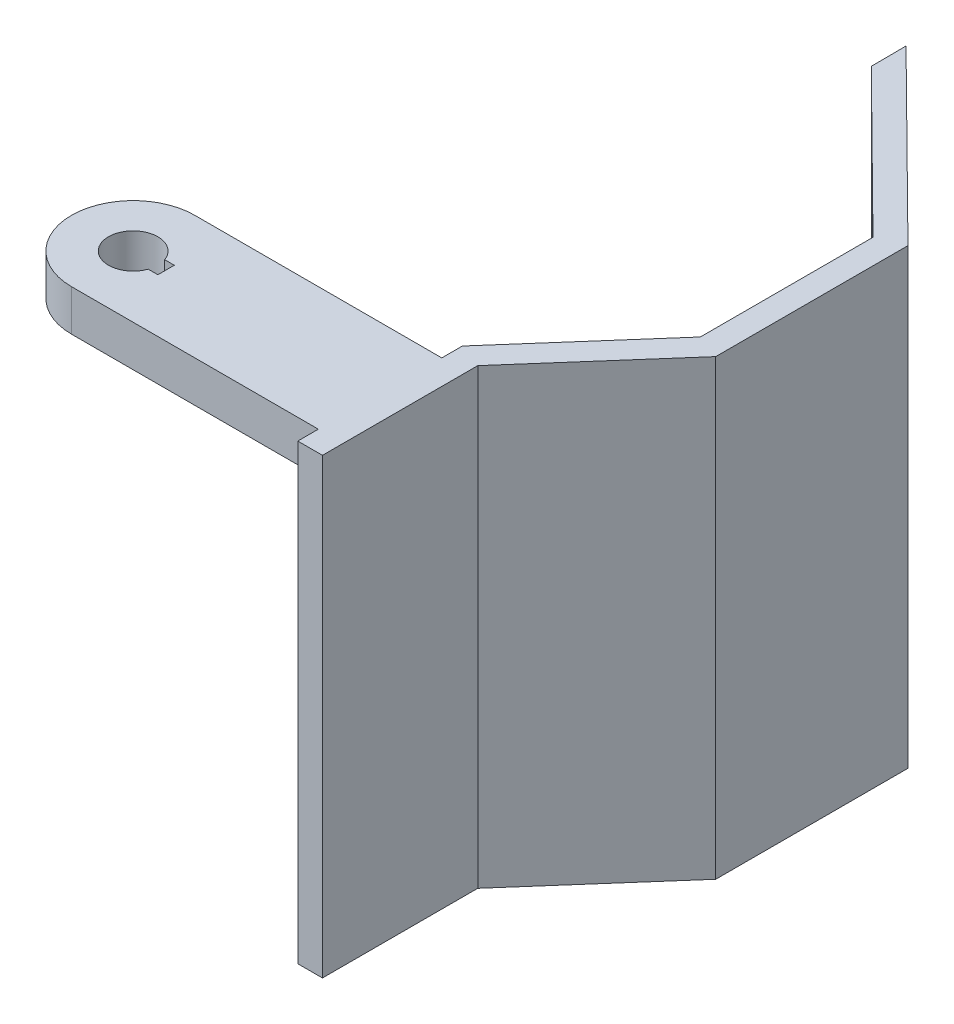
ISO-10303-21;
HEADER;
FILE_DESCRIPTION(('STEP AP214'),'2;1');
FILE_NAME('part.step','',(''),(''),'','','');
FILE_SCHEMA(('AUTOMOTIVE_DESIGN { 1 0 10303 214 1 1 1 1 }'));
ENDSEC;
DATA;
#1=APPLICATION_CONTEXT('core data for automotive mechanical design processes');
#2=APPLICATION_PROTOCOL_DEFINITION('international standard','automotive_design',2000,#1);
#3=PRODUCT_CONTEXT('',#1,'mechanical');
#4=PRODUCT('Part','Part','',(#3));
#5=PRODUCT_RELATED_PRODUCT_CATEGORY('part','',(#4));
#6=PRODUCT_DEFINITION_FORMATION('','',#4);
#7=PRODUCT_DEFINITION_CONTEXT('part definition',#1,'design');
#8=PRODUCT_DEFINITION('design','',#6,#7);
#9=PRODUCT_DEFINITION_SHAPE('','',#8);
#10=(LENGTH_UNIT() NAMED_UNIT(*) SI_UNIT(.MILLI.,.METRE.));
#11=(NAMED_UNIT(*) PLANE_ANGLE_UNIT() SI_UNIT($,.RADIAN.));
#12=(NAMED_UNIT(*) SI_UNIT($,.STERADIAN.) SOLID_ANGLE_UNIT());
#13=UNCERTAINTY_MEASURE_WITH_UNIT(LENGTH_MEASURE(1.E-05),#10,'distance_accuracy_value','');
#14=(GEOMETRIC_REPRESENTATION_CONTEXT(3) GLOBAL_UNCERTAINTY_ASSIGNED_CONTEXT((#13)) GLOBAL_UNIT_ASSIGNED_CONTEXT((#10,
#11,#12)) REPRESENTATION_CONTEXT('',''));
#15=CARTESIAN_POINT('',(0.,0.,0.));
#16=DIRECTION('',(0.,0.,1.));
#17=DIRECTION('',(1.,0.,0.));
#18=AXIS2_PLACEMENT_3D('',#15,#16,#17);
#19=CARTESIAN_POINT('',(0.,55.,0.));
#20=DIRECTION('',(0.,0.,1.));
#21=DIRECTION('',(-1.,0.,0.));
#22=AXIS2_PLACEMENT_3D('',#19,#20,#21);
#23=PLANE('',#22);
#24=DIRECTION('',(1.,0.,0.));
#25=VECTOR('',#24,1.);
#26=CARTESIAN_POINT('',(0.,0.,0.));
#27=LINE('',#26,#25);
#28=CARTESIAN_POINT('',(-3.,0.,0.));
#29=VERTEX_POINT('',#28);
#30=CARTESIAN_POINT('',(0.,0.,0.));
#31=VERTEX_POINT('',#30);
#32=EDGE_CURVE('E236',#29,#31,#27,.T.);
#33=ORIENTED_EDGE('',*,*,#32,.T.);
#34=DIRECTION('',(0.,-1.,0.));
#35=VECTOR('',#34,1.);
#36=CARTESIAN_POINT('',(0.,55.,0.));
#37=LINE('',#36,#35);
#38=CARTESIAN_POINT('',(0.,55.,0.));
#39=VERTEX_POINT('',#38);
#40=EDGE_CURVE('E284',#39,#31,#37,.T.);
#41=ORIENTED_EDGE('',*,*,#40,.F.);
#42=DIRECTION('',(1.,0.,0.));
#43=VECTOR('',#42,1.);
#44=CARTESIAN_POINT('',(0.,55.,0.));
#45=LINE('',#44,#43);
#46=CARTESIAN_POINT('',(-3.,55.,0.));
#47=VERTEX_POINT('',#46);
#48=EDGE_CURVE('E246',#47,#39,#45,.T.);
#49=ORIENTED_EDGE('',*,*,#48,.F.);
#50=DIRECTION('',(0.,-1.,0.));
#51=VECTOR('',#50,1.);
#52=CARTESIAN_POINT('',(-3.,55.,0.));
#53=LINE('',#52,#51);
#54=EDGE_CURVE('E354',#47,#29,#53,.T.);
#55=ORIENTED_EDGE('',*,*,#54,.T.);
#56=EDGE_LOOP('',(#33,#41,#49,#55));
#57=FACE_BOUND('',#56,.T.);
#58=ADVANCED_FACE('F48',(#57),#23,.T.);
#59=CARTESIAN_POINT('',(-3.,55.,0.));
#60=DIRECTION('',(1.,0.,0.));
#61=DIRECTION('',(0.,0.,1.));
#62=AXIS2_PLACEMENT_3D('',#59,#60,#61);
#63=PLANE('',#62);
#64=DIRECTION('',(0.,0.,-1.));
#65=VECTOR('',#64,1.);
#66=CARTESIAN_POINT('',(-3.,55.,0.));
#67=LINE('',#66,#65);
#68=CARTESIAN_POINT('',(-3.,55.,-17.5));
#69=VERTEX_POINT('',#68);
#70=CARTESIAN_POINT('',(-3.,55.,-20.));
#71=VERTEX_POINT('',#70);
#72=EDGE_CURVE('E250',#69,#71,#67,.T.);
#73=ORIENTED_EDGE('',*,*,#72,.T.);
#74=DIRECTION('',(0.,-1.,0.));
#75=VECTOR('',#74,1.);
#76=CARTESIAN_POINT('',(-3.,55.,-20.));
#77=LINE('',#76,#75);
#78=CARTESIAN_POINT('',(-3.,0.,-20.));
#79=VERTEX_POINT('',#78);
#80=EDGE_CURVE('E350',#71,#79,#77,.T.);
#81=ORIENTED_EDGE('',*,*,#80,.T.);
#82=DIRECTION('',(0.,0.,-1.));
#83=VECTOR('',#82,1.);
#84=CARTESIAN_POINT('',(-3.,0.,0.));
#85=LINE('',#84,#83);
#86=EDGE_CURVE('E288',#29,#79,#85,.T.);
#87=ORIENTED_EDGE('',*,*,#86,.F.);
#88=ORIENTED_EDGE('',*,*,#54,.F.);
#89=CARTESIAN_POINT('',(-3.,55.,-2.5));
#90=VERTEX_POINT('',#89);
#91=EDGE_CURVE('E252',#47,#90,#67,.T.);
#92=ORIENTED_EDGE('',*,*,#91,.T.);
#93=DIRECTION('',(0.,1.,0.));
#94=VECTOR('',#93,1.);
#95=CARTESIAN_POINT('',(-3.,50.,-2.5));
#96=LINE('',#95,#94);
#97=CARTESIAN_POINT('',(-3.,50.,-2.5));
#98=VERTEX_POINT('',#97);
#99=EDGE_CURVE('E223',#98,#90,#96,.T.);
#100=ORIENTED_EDGE('',*,*,#99,.F.);
#101=DIRECTION('',(0.,0.,1.));
#102=VECTOR('',#101,1.);
#103=CARTESIAN_POINT('',(-3.,50.,0.));
#104=LINE('',#103,#102);
#105=CARTESIAN_POINT('',(-3.,50.,-17.5));
#106=VERTEX_POINT('',#105);
#107=EDGE_CURVE('E209',#106,#98,#104,.T.);
#108=ORIENTED_EDGE('',*,*,#107,.F.);
#109=DIRECTION('',(0.,1.,0.));
#110=VECTOR('',#109,1.);
#111=CARTESIAN_POINT('',(-3.,50.,-17.5));
#112=LINE('',#111,#110);
#113=EDGE_CURVE('E232',#106,#69,#112,.T.);
#114=ORIENTED_EDGE('',*,*,#113,.T.);
#115=EDGE_LOOP('',(#73,#81,#87,#88,#92,#100,#108,#114));
#116=FACE_BOUND('',#115,.T.);
#117=ADVANCED_FACE('F382',(#116),#63,.F.);
#118=CARTESIAN_POINT('',(-11.6103440031896,55.,-10.1759094573042));
#119=DIRECTION('',(0.752035287081566,0.,0.659122846656181));
#120=DIRECTION('',(-0.659122846656181,0.,0.752035287081566));
#121=AXIS2_PLACEMENT_3D('',#118,#119,#120);
#122=PLANE('',#121);
#123=DIRECTION('',(0.659122846656181,0.,-0.752035287081566));
#124=VECTOR('',#123,1.);
#125=CARTESIAN_POINT('',(-11.6103440031896,0.,-10.1759094573042));
#126=LINE('',#125,#124);
#127=CARTESIAN_POINT('',(10.505514798512,0.,-35.409303061196));
#128=VERTEX_POINT('',#127);
#129=EDGE_CURVE('E292',#79,#128,#126,.T.);
#130=ORIENTED_EDGE('',*,*,#129,.F.);
#131=ORIENTED_EDGE('',*,*,#80,.F.);
#132=DIRECTION('',(0.659122846656181,0.,-0.752035287081566));
#133=VECTOR('',#132,1.);
#134=CARTESIAN_POINT('',(-11.6103440031896,55.,-10.1759094573042));
#135=LINE('',#134,#133);
#136=CARTESIAN_POINT('',(10.505514798512,55.,-35.409303061196));
#137=VERTEX_POINT('',#136);
#138=EDGE_CURVE('E256',#71,#137,#135,.T.);
#139=ORIENTED_EDGE('',*,*,#138,.T.);
#140=DIRECTION('',(0.,-1.,0.));
#141=VECTOR('',#140,1.);
#142=CARTESIAN_POINT('',(10.505514798512,55.,-35.409303061196));
#143=LINE('',#142,#141);
#144=EDGE_CURVE('E346',#137,#128,#143,.T.);
#145=ORIENTED_EDGE('',*,*,#144,.T.);
#146=EDGE_LOOP('',(#130,#131,#139,#145));
#147=FACE_BOUND('',#146,.T.);
#148=ADVANCED_FACE('F387',(#147),#122,.F.);
#149=CARTESIAN_POINT('',(10.505514798512,55.,0.));
#150=DIRECTION('',(1.,0.,0.));
#151=DIRECTION('',(0.,0.,1.));
#152=AXIS2_PLACEMENT_3D('',#149,#150,#151);
#153=PLANE('',#152);
#154=DIRECTION('',(0.,0.,-1.));
#155=VECTOR('',#154,1.);
#156=CARTESIAN_POINT('',(10.505514798512,0.,0.));
#157=LINE('',#156,#155);
#158=CARTESIAN_POINT('',(10.505514798512,0.,-56.3844767940236));
#159=VERTEX_POINT('',#158);
#160=EDGE_CURVE('E296',#128,#159,#157,.T.);
#161=ORIENTED_EDGE('',*,*,#160,.F.);
#162=ORIENTED_EDGE('',*,*,#144,.F.);
#163=DIRECTION('',(0.,0.,-1.));
#164=VECTOR('',#163,1.);
#165=CARTESIAN_POINT('',(10.505514798512,55.,0.));
#166=LINE('',#165,#164);
#167=CARTESIAN_POINT('',(10.505514798512,55.,-56.3844767940236));
#168=VERTEX_POINT('',#167);
#169=EDGE_CURVE('E260',#137,#168,#166,.T.);
#170=ORIENTED_EDGE('',*,*,#169,.T.);
#171=DIRECTION('',(0.,-1.,0.));
#172=VECTOR('',#171,1.);
#173=CARTESIAN_POINT('',(10.505514798512,55.,-56.3844767940236));
#174=LINE('',#173,#172);
#175=EDGE_CURVE('E342',#168,#159,#174,.T.);
#176=ORIENTED_EDGE('',*,*,#175,.T.);
#177=EDGE_LOOP('',(#161,#162,#170,#176));
#178=FACE_BOUND('',#177,.T.);
#179=ADVANCED_FACE('F410',(#178),#153,.F.);
#180=CARTESIAN_POINT('',(33.3838448037325,55.,-33.7632066765023));
#181=DIRECTION('',(0.70310060646766,0.,-0.711090386086614));
#182=DIRECTION('',(0.711090386086614,0.,0.70310060646766));
#183=AXIS2_PLACEMENT_3D('',#180,#181,#182);
#184=PLANE('',#183);
#185=DIRECTION('',(-0.711090386086614,0.,-0.70310060646766));
#186=VECTOR('',#185,1.);
#187=CARTESIAN_POINT('',(33.3838448037325,0.,-33.7632066765023));
#188=LINE('',#187,#186);
#189=CARTESIAN_POINT('',(-7.59252972399853,0.,-74.2791725016744));
#190=VERTEX_POINT('',#189);
#191=EDGE_CURVE('E300',#159,#190,#188,.T.);
#192=ORIENTED_EDGE('',*,*,#191,.F.);
#193=ORIENTED_EDGE('',*,*,#175,.F.);
#194=DIRECTION('',(-0.711090386086614,0.,-0.70310060646766));
#195=VECTOR('',#194,1.);
#196=CARTESIAN_POINT('',(33.3838448037325,55.,-33.7632066765023));
#197=LINE('',#196,#195);
#198=CARTESIAN_POINT('',(-7.59252972399853,55.,-74.2791725016744));
#199=VERTEX_POINT('',#198);
#200=EDGE_CURVE('E264',#168,#199,#197,.T.);
#201=ORIENTED_EDGE('',*,*,#200,.T.);
#202=DIRECTION('',(0.,-1.,0.));
#203=VECTOR('',#202,1.);
#204=CARTESIAN_POINT('',(-7.59252972399853,55.,-74.2791725016744));
#205=LINE('',#204,#203);
#206=EDGE_CURVE('E338',#199,#190,#205,.T.);
#207=ORIENTED_EDGE('',*,*,#206,.T.);
#208=EDGE_LOOP('',(#192,#193,#201,#207));
#209=FACE_BOUND('',#208,.T.);
#210=ADVANCED_FACE('F413',(#209),#184,.F.);
#211=CARTESIAN_POINT('',(-7.17264443633418,55.,0.0405234148945547));
#212=DIRECTION('',(0.999984040728061,0.,-0.00564962734874768));
#213=DIRECTION('',(0.00564962734874768,0.,0.999984040728061));
#214=AXIS2_PLACEMENT_3D('',#211,#212,#213);
#215=PLANE('',#214);
#216=DIRECTION('',(-0.00564962734874768,0.,-0.999984040728061));
#217=VECTOR('',#216,1.);
#218=CARTESIAN_POINT('',(-7.17264443633418,0.,0.0405234148945547));
#219=LINE('',#218,#217);
#220=CARTESIAN_POINT('',(-7.61649906285539,0.,-78.5217454793372));
#221=VERTEX_POINT('',#220);
#222=EDGE_CURVE('E304',#190,#221,#219,.T.);
#223=ORIENTED_EDGE('',*,*,#222,.F.);
#224=ORIENTED_EDGE('',*,*,#206,.F.);
#225=DIRECTION('',(-0.00564962734874768,0.,-0.999984040728061));
#226=VECTOR('',#225,1.);
#227=CARTESIAN_POINT('',(-7.17264443633418,55.,0.0405234148945547));
#228=LINE('',#227,#226);
#229=CARTESIAN_POINT('',(-7.61649906285539,55.,-78.5217454793372));
#230=VERTEX_POINT('',#229);
#231=EDGE_CURVE('E268',#199,#230,#228,.T.);
#232=ORIENTED_EDGE('',*,*,#231,.T.);
#233=DIRECTION('',(0.,-1.,0.));
#234=VECTOR('',#233,1.);
#235=CARTESIAN_POINT('',(-7.61649906285539,55.,-78.5217454793372));
#236=LINE('',#235,#234);
#237=EDGE_CURVE('E334',#230,#221,#236,.T.);
#238=ORIENTED_EDGE('',*,*,#237,.T.);
#239=EDGE_LOOP('',(#223,#224,#232,#238));
#240=FACE_BOUND('',#239,.T.);
#241=ADVANCED_FACE('F416',(#240),#215,.F.);
#242=CARTESIAN_POINT('',(35.4931466231355,55.,-35.8964778347622));
#243=DIRECTION('',(0.70310060646766,0.,-0.711090386086614));
#244=DIRECTION('',(0.711090386086614,0.,0.70310060646766));
#245=AXIS2_PLACEMENT_3D('',#242,#243,#244);
#246=PLANE('',#245);
#247=DIRECTION('',(-0.711090386086614,0.,-0.70310060646766));
#248=VECTOR('',#247,1.);
#249=CARTESIAN_POINT('',(35.4931466231355,0.,-35.8964778347622));
#250=LINE('',#249,#248);
#251=CARTESIAN_POINT('',(13.505514798512,0.,-57.6370576164122));
#252=VERTEX_POINT('',#251);
#253=EDGE_CURVE('E308',#252,#221,#250,.T.);
#254=ORIENTED_EDGE('',*,*,#253,.T.);
#255=ORIENTED_EDGE('',*,*,#237,.F.);
#256=DIRECTION('',(-0.711090386086614,0.,-0.70310060646766));
#257=VECTOR('',#256,1.);
#258=CARTESIAN_POINT('',(35.4931466231355,55.,-35.8964778347622));
#259=LINE('',#258,#257);
#260=CARTESIAN_POINT('',(13.505514798512,55.,-57.6370576164122));
#261=VERTEX_POINT('',#260);
#262=EDGE_CURVE('E272',#261,#230,#259,.T.);
#263=ORIENTED_EDGE('',*,*,#262,.F.);
#264=DIRECTION('',(0.,-1.,0.));
#265=VECTOR('',#264,1.);
#266=CARTESIAN_POINT('',(13.505514798512,55.,-57.6370576164122));
#267=LINE('',#266,#265);
#268=EDGE_CURVE('E330',#261,#252,#267,.T.);
#269=ORIENTED_EDGE('',*,*,#268,.T.);
#270=EDGE_LOOP('',(#254,#255,#263,#269));
#271=FACE_BOUND('',#270,.T.);
#272=ADVANCED_FACE('F420',(#271),#246,.T.);
#273=CARTESIAN_POINT('',(13.505514798512,55.,0.));
#274=DIRECTION('',(1.,0.,0.));
#275=DIRECTION('',(0.,0.,1.));
#276=AXIS2_PLACEMENT_3D('',#273,#274,#275);
#277=PLANE('',#276);
#278=DIRECTION('',(0.,0.,-1.));
#279=VECTOR('',#278,1.);
#280=CARTESIAN_POINT('',(13.505514798512,0.,0.));
#281=LINE('',#280,#279);
#282=CARTESIAN_POINT('',(13.505514798512,0.,-34.2806907812103));
#283=VERTEX_POINT('',#282);
#284=EDGE_CURVE('E311',#283,#252,#281,.T.);
#285=ORIENTED_EDGE('',*,*,#284,.T.);
#286=ORIENTED_EDGE('',*,*,#268,.F.);
#287=DIRECTION('',(0.,0.,-1.));
#288=VECTOR('',#287,1.);
#289=CARTESIAN_POINT('',(13.505514798512,55.,0.));
#290=LINE('',#289,#288);
#291=CARTESIAN_POINT('',(13.505514798512,55.,-34.2806907812103));
#292=VERTEX_POINT('',#291);
#293=EDGE_CURVE('E275',#292,#261,#290,.T.);
#294=ORIENTED_EDGE('',*,*,#293,.F.);
#295=DIRECTION('',(0.,-1.,0.));
#296=VECTOR('',#295,1.);
#297=CARTESIAN_POINT('',(13.505514798512,55.,-34.2806907812103));
#298=LINE('',#297,#296);
#299=EDGE_CURVE('E326',#292,#283,#298,.T.);
#300=ORIENTED_EDGE('',*,*,#299,.T.);
#301=EDGE_LOOP('',(#285,#286,#294,#300));
#302=FACE_BOUND('',#301,.T.);
#303=ADVANCED_FACE('F425',(#302),#277,.T.);
#304=CARTESIAN_POINT('',(-9.35423814194485,55.,-8.19854091733569));
#305=DIRECTION('',(0.752035287081566,0.,0.659122846656181));
#306=DIRECTION('',(-0.659122846656181,0.,0.752035287081566));
#307=AXIS2_PLACEMENT_3D('',#304,#305,#306);
#308=PLANE('',#307);
#309=DIRECTION('',(0.659122846656181,0.,-0.752035287081566));
#310=VECTOR('',#309,1.);
#311=CARTESIAN_POINT('',(-9.35423814194485,0.,-8.19854091733569));
#312=LINE('',#311,#310);
#313=CARTESIAN_POINT('',(0.,0.,-18.8713877200143));
#314=VERTEX_POINT('',#313);
#315=EDGE_CURVE('E314',#314,#283,#312,.T.);
#316=ORIENTED_EDGE('',*,*,#315,.T.);
#317=ORIENTED_EDGE('',*,*,#299,.F.);
#318=DIRECTION('',(0.659122846656181,0.,-0.752035287081566));
#319=VECTOR('',#318,1.);
#320=CARTESIAN_POINT('',(-9.35423814194485,55.,-8.19854091733569));
#321=LINE('',#320,#319);
#322=CARTESIAN_POINT('',(0.,55.,-18.8713877200143));
#323=VERTEX_POINT('',#322);
#324=EDGE_CURVE('E278',#323,#292,#321,.T.);
#325=ORIENTED_EDGE('',*,*,#324,.F.);
#326=DIRECTION('',(0.,-1.,0.));
#327=VECTOR('',#326,1.);
#328=CARTESIAN_POINT('',(0.,55.,-18.8713877200143));
#329=LINE('',#328,#327);
#330=EDGE_CURVE('E322',#323,#314,#329,.T.);
#331=ORIENTED_EDGE('',*,*,#330,.T.);
#332=EDGE_LOOP('',(#316,#317,#325,#331));
#333=FACE_BOUND('',#332,.T.);
#334=ADVANCED_FACE('F428',(#333),#308,.T.);
#335=CARTESIAN_POINT('',(0.,55.,0.));
#336=DIRECTION('',(1.,0.,0.));
#337=DIRECTION('',(0.,0.,1.));
#338=AXIS2_PLACEMENT_3D('',#335,#336,#337);
#339=PLANE('',#338);
#340=DIRECTION('',(0.,0.,-1.));
#341=VECTOR('',#340,1.);
#342=CARTESIAN_POINT('',(0.,0.,0.));
#343=LINE('',#342,#341);
#344=EDGE_CURVE('E251',#31,#314,#343,.T.);
#345=ORIENTED_EDGE('',*,*,#344,.T.);
#346=ORIENTED_EDGE('',*,*,#330,.F.);
#347=DIRECTION('',(0.,0.,-1.));
#348=VECTOR('',#347,1.);
#349=CARTESIAN_POINT('',(0.,55.,0.));
#350=LINE('',#349,#348);
#351=EDGE_CURVE('E281',#39,#323,#350,.T.);
#352=ORIENTED_EDGE('',*,*,#351,.F.);
#353=ORIENTED_EDGE('',*,*,#40,.T.);
#354=EDGE_LOOP('',(#345,#346,#352,#353));
#355=FACE_BOUND('',#354,.T.);
#356=ADVANCED_FACE('F399',(#355),#339,.T.);
#357=CARTESIAN_POINT('',(0.,55.,0.));
#358=DIRECTION('',(0.,1.,0.));
#359=DIRECTION('',(0.,0.,1.));
#360=AXIS2_PLACEMENT_3D('',#357,#358,#359);
#361=PLANE('',#360);
#362=CARTESIAN_POINT('',(-33.,55.,-10.));
#363=DIRECTION('',(0.,1.,0.));
#364=DIRECTION('',(0.,0.,1.));
#365=AXIS2_PLACEMENT_3D('',#362,#363,#364);
#366=CIRCLE('',#365,3.);
#367=CARTESIAN_POINT('',(-30.1715728752538,55.,-11.));
#368=VERTEX_POINT('',#367);
#369=CARTESIAN_POINT('',(-30.1715728752538,55.,-9.00000000000001));
#370=VERTEX_POINT('',#369);
#371=EDGE_CURVE('E63',#368,#370,#366,.T.);
#372=ORIENTED_EDGE('',*,*,#371,.F.);
#373=DIRECTION('',(-1.,0.,0.));
#374=VECTOR('',#373,1.);
#375=CARTESIAN_POINT('',(-29.,55.,-11.));
#376=LINE('',#375,#374);
#377=CARTESIAN_POINT('',(-29.,55.,-11.));
#378=VERTEX_POINT('',#377);
#379=EDGE_CURVE('E194',#378,#368,#376,.T.);
#380=ORIENTED_EDGE('',*,*,#379,.F.);
#381=DIRECTION('',(0.,0.,-1.));
#382=VECTOR('',#381,1.);
#383=CARTESIAN_POINT('',(-29.,55.,-9.00000000000001));
#384=LINE('',#383,#382);
#385=CARTESIAN_POINT('',(-29.,55.,-9.00000000000001));
#386=VERTEX_POINT('',#385);
#387=EDGE_CURVE('E176',#386,#378,#384,.T.);
#388=ORIENTED_EDGE('',*,*,#387,.F.);
#389=DIRECTION('',(1.,0.,0.));
#390=VECTOR('',#389,1.);
#391=CARTESIAN_POINT('',(-30.1715728752538,55.,-9.00000000000001));
#392=LINE('',#391,#390);
#393=EDGE_CURVE('E186',#370,#386,#392,.T.);
#394=ORIENTED_EDGE('',*,*,#393,.F.);
#395=EDGE_LOOP('',(#372,#380,#388,#394));
#396=FACE_BOUND('',#395,.T.);
#397=ORIENTED_EDGE('',*,*,#48,.T.);
#398=ORIENTED_EDGE('',*,*,#351,.T.);
#399=ORIENTED_EDGE('',*,*,#324,.T.);
#400=ORIENTED_EDGE('',*,*,#293,.T.);
#401=ORIENTED_EDGE('',*,*,#262,.T.);
#402=ORIENTED_EDGE('',*,*,#231,.F.);
#403=ORIENTED_EDGE('',*,*,#200,.F.);
#404=ORIENTED_EDGE('',*,*,#169,.F.);
#405=ORIENTED_EDGE('',*,*,#138,.F.);
#406=ORIENTED_EDGE('',*,*,#72,.F.);
#407=DIRECTION('',(1.,0.,0.));
#408=VECTOR('',#407,1.);
#409=CARTESIAN_POINT('',(0.,55.,-17.5));
#410=LINE('',#409,#408);
#411=CARTESIAN_POINT('',(-33.,55.,-17.5));
#412=VERTEX_POINT('',#411);
#413=EDGE_CURVE('E214',#412,#69,#410,.T.);
#414=ORIENTED_EDGE('',*,*,#413,.F.);
#415=CARTESIAN_POINT('',(-33.,55.,-10.));
#416=DIRECTION('',(0.,-1.,0.));
#417=DIRECTION('',(0.,0.,1.));
#418=AXIS2_PLACEMENT_3D('',#415,#416,#417);
#419=CIRCLE('',#418,7.5);
#420=CARTESIAN_POINT('',(-33.,55.,-2.5));
#421=VERTEX_POINT('',#420);
#422=EDGE_CURVE('E226',#421,#412,#419,.T.);
#423=ORIENTED_EDGE('',*,*,#422,.F.);
#424=DIRECTION('',(1.,0.,0.));
#425=VECTOR('',#424,1.);
#426=CARTESIAN_POINT('',(0.,55.,-2.5));
#427=LINE('',#426,#425);
#428=EDGE_CURVE('E204',#421,#90,#427,.T.);
#429=ORIENTED_EDGE('',*,*,#428,.T.);
#430=ORIENTED_EDGE('',*,*,#91,.F.);
#431=EDGE_LOOP('',(#397,#398,#399,#400,#401,#402,#403,#404,#405,#406,#414,#423,#429,#430));
#432=FACE_BOUND('',#431,.T.);
#433=ADVANCED_FACE('F191',(#396,#432),#361,.T.);
#434=CARTESIAN_POINT('',(0.,0.,0.));
#435=DIRECTION('',(0.,1.,0.));
#436=DIRECTION('',(0.,0.,1.));
#437=AXIS2_PLACEMENT_3D('',#434,#435,#436);
#438=PLANE('',#437);
#439=ORIENTED_EDGE('',*,*,#32,.F.);
#440=ORIENTED_EDGE('',*,*,#86,.T.);
#441=ORIENTED_EDGE('',*,*,#129,.T.);
#442=ORIENTED_EDGE('',*,*,#160,.T.);
#443=ORIENTED_EDGE('',*,*,#191,.T.);
#444=ORIENTED_EDGE('',*,*,#222,.T.);
#445=ORIENTED_EDGE('',*,*,#253,.F.);
#446=ORIENTED_EDGE('',*,*,#284,.F.);
#447=ORIENTED_EDGE('',*,*,#315,.F.);
#448=ORIENTED_EDGE('',*,*,#344,.F.);
#449=EDGE_LOOP('',(#439,#440,#441,#442,#443,#444,#445,#446,#447,#448));
#450=FACE_BOUND('',#449,.T.);
#451=ADVANCED_FACE('F394',(#450),#438,.F.);
#452=CARTESIAN_POINT('',(0.,50.,-17.5));
#453=DIRECTION('',(0.,0.,-1.));
#454=DIRECTION('',(1.,0.,0.));
#455=AXIS2_PLACEMENT_3D('',#452,#453,#454);
#456=PLANE('',#455);
#457=ORIENTED_EDGE('',*,*,#413,.T.);
#458=ORIENTED_EDGE('',*,*,#113,.F.);
#459=DIRECTION('',(1.,0.,0.));
#460=VECTOR('',#459,1.);
#461=CARTESIAN_POINT('',(0.,50.,-17.5));
#462=LINE('',#461,#460);
#463=CARTESIAN_POINT('',(-33.,50.,-17.5));
#464=VERTEX_POINT('',#463);
#465=EDGE_CURVE('E220',#464,#106,#462,.T.);
#466=ORIENTED_EDGE('',*,*,#465,.F.);
#467=DIRECTION('',(0.,1.,0.));
#468=VECTOR('',#467,1.);
#469=CARTESIAN_POINT('',(-33.,50.,-17.5));
#470=LINE('',#469,#468);
#471=EDGE_CURVE('E237',#464,#412,#470,.T.);
#472=ORIENTED_EDGE('',*,*,#471,.T.);
#473=EDGE_LOOP('',(#457,#458,#466,#472));
#474=FACE_BOUND('',#473,.T.);
#475=ADVANCED_FACE('F433',(#474),#456,.T.);
#476=CARTESIAN_POINT('',(-33.,50.,-10.));
#477=DIRECTION('',(0.,1.,0.));
#478=DIRECTION('',(0.,0.,1.));
#479=AXIS2_PLACEMENT_3D('',#476,#477,#478);
#480=CYLINDRICAL_SURFACE('',#479,7.5);
#481=ORIENTED_EDGE('',*,*,#422,.T.);
#482=ORIENTED_EDGE('',*,*,#471,.F.);
#483=CARTESIAN_POINT('',(-33.,50.,-10.));
#484=DIRECTION('',(0.,-1.,0.));
#485=DIRECTION('',(0.,0.,1.));
#486=AXIS2_PLACEMENT_3D('',#483,#484,#485);
#487=CIRCLE('',#486,7.5);
#488=CARTESIAN_POINT('',(-33.,50.,-2.5));
#489=VERTEX_POINT('',#488);
#490=EDGE_CURVE('E217',#489,#464,#487,.T.);
#491=ORIENTED_EDGE('',*,*,#490,.F.);
#492=DIRECTION('',(0.,1.,0.));
#493=VECTOR('',#492,1.);
#494=CARTESIAN_POINT('',(-33.,50.,-2.5));
#495=LINE('',#494,#493);
#496=EDGE_CURVE('E240',#489,#421,#495,.T.);
#497=ORIENTED_EDGE('',*,*,#496,.T.);
#498=EDGE_LOOP('',(#481,#482,#491,#497));
#499=FACE_BOUND('',#498,.T.);
#500=ADVANCED_FACE('F440',(#499),#480,.T.);
#501=CARTESIAN_POINT('',(0.,50.,-2.5));
#502=DIRECTION('',(0.,0.,-1.));
#503=DIRECTION('',(1.,0.,0.));
#504=AXIS2_PLACEMENT_3D('',#501,#502,#503);
#505=PLANE('',#504);
#506=ORIENTED_EDGE('',*,*,#428,.F.);
#507=ORIENTED_EDGE('',*,*,#496,.F.);
#508=DIRECTION('',(1.,0.,0.));
#509=VECTOR('',#508,1.);
#510=CARTESIAN_POINT('',(0.,50.,-2.5));
#511=LINE('',#510,#509);
#512=EDGE_CURVE('E213',#489,#98,#511,.T.);
#513=ORIENTED_EDGE('',*,*,#512,.T.);
#514=ORIENTED_EDGE('',*,*,#99,.T.);
#515=EDGE_LOOP('',(#506,#507,#513,#514));
#516=FACE_BOUND('',#515,.T.);
#517=ADVANCED_FACE('F378',(#516),#505,.F.);
#518=CARTESIAN_POINT('',(-33.,50.,-10.));
#519=DIRECTION('',(0.,1.,0.));
#520=DIRECTION('',(0.,0.,1.));
#521=AXIS2_PLACEMENT_3D('',#518,#519,#520);
#522=PLANE('',#521);
#523=DIRECTION('',(-1.,0.,0.));
#524=VECTOR('',#523,1.);
#525=CARTESIAN_POINT('',(-33.,50.,-11.));
#526=LINE('',#525,#524);
#527=CARTESIAN_POINT('',(-29.,50.,-11.));
#528=VERTEX_POINT('',#527);
#529=CARTESIAN_POINT('',(-30.1715728752538,50.,-11.));
#530=VERTEX_POINT('',#529);
#531=EDGE_CURVE('E56',#528,#530,#526,.T.);
#532=ORIENTED_EDGE('',*,*,#531,.T.);
#533=CARTESIAN_POINT('',(-33.,50.,-10.));
#534=DIRECTION('',(0.,1.,0.));
#535=DIRECTION('',(0.,0.,1.));
#536=AXIS2_PLACEMENT_3D('',#533,#534,#535);
#537=CIRCLE('',#536,3.);
#538=CARTESIAN_POINT('',(-30.1715728752538,50.,-9.00000000000001));
#539=VERTEX_POINT('',#538);
#540=EDGE_CURVE('E11',#530,#539,#537,.T.);
#541=ORIENTED_EDGE('',*,*,#540,.T.);
#542=DIRECTION('',(1.,0.,0.));
#543=VECTOR('',#542,1.);
#544=CARTESIAN_POINT('',(-33.,50.,-9.00000000000001));
#545=LINE('',#544,#543);
#546=CARTESIAN_POINT('',(-29.,50.,-9.00000000000001));
#547=VERTEX_POINT('',#546);
#548=EDGE_CURVE('E358',#539,#547,#545,.T.);
#549=ORIENTED_EDGE('',*,*,#548,.T.);
#550=DIRECTION('',(0.,0.,-1.));
#551=VECTOR('',#550,1.);
#552=CARTESIAN_POINT('',(-29.,50.,-10.));
#553=LINE('',#552,#551);
#554=EDGE_CURVE('E179',#547,#528,#553,.T.);
#555=ORIENTED_EDGE('',*,*,#554,.T.);
#556=EDGE_LOOP('',(#532,#541,#549,#555));
#557=FACE_BOUND('',#556,.T.);
#558=ORIENTED_EDGE('',*,*,#107,.T.);
#559=ORIENTED_EDGE('',*,*,#512,.F.);
#560=ORIENTED_EDGE('',*,*,#490,.T.);
#561=ORIENTED_EDGE('',*,*,#465,.T.);
#562=EDGE_LOOP('',(#558,#559,#560,#561));
#563=FACE_BOUND('',#562,.T.);
#564=ADVANCED_FACE('F365',(#557,#563),#522,.F.);
#565=CARTESIAN_POINT('',(-33.,0.,-10.));
#566=DIRECTION('',(0.,1.,0.));
#567=DIRECTION('',(0.,0.,1.));
#568=AXIS2_PLACEMENT_3D('',#565,#566,#567);
#569=CYLINDRICAL_SURFACE('',#568,3.);
#570=DIRECTION('',(0.,1.,0.));
#571=VECTOR('',#570,1.);
#572=CARTESIAN_POINT('',(-30.1715728752538,0.,-11.));
#573=LINE('',#572,#571);
#574=EDGE_CURVE('E201',#530,#368,#573,.T.);
#575=ORIENTED_EDGE('',*,*,#574,.T.);
#576=ORIENTED_EDGE('',*,*,#371,.T.);
#577=DIRECTION('',(0.,1.,0.));
#578=VECTOR('',#577,1.);
#579=CARTESIAN_POINT('',(-30.1715728752538,0.,-9.00000000000001));
#580=LINE('',#579,#578);
#581=EDGE_CURVE('E183',#539,#370,#580,.T.);
#582=ORIENTED_EDGE('',*,*,#581,.F.);
#583=ORIENTED_EDGE('',*,*,#540,.F.);
#584=EDGE_LOOP('',(#575,#576,#582,#583));
#585=FACE_BOUND('',#584,.T.);
#586=ADVANCED_FACE('F370',(#585),#569,.F.);
#587=CARTESIAN_POINT('',(-29.,0.,-11.));
#588=DIRECTION('',(0.,0.,-1.));
#589=DIRECTION('',(-1.,0.,0.));
#590=AXIS2_PLACEMENT_3D('',#587,#588,#589);
#591=PLANE('',#590);
#592=DIRECTION('',(0.,1.,0.));
#593=VECTOR('',#592,1.);
#594=CARTESIAN_POINT('',(-29.,0.,-11.));
#595=LINE('',#594,#593);
#596=EDGE_CURVE('E182',#528,#378,#595,.T.);
#597=ORIENTED_EDGE('',*,*,#596,.T.);
#598=ORIENTED_EDGE('',*,*,#379,.T.);
#599=ORIENTED_EDGE('',*,*,#574,.F.);
#600=ORIENTED_EDGE('',*,*,#531,.F.);
#601=EDGE_LOOP('',(#597,#598,#599,#600));
#602=FACE_BOUND('',#601,.T.);
#603=ADVANCED_FACE('F369',(#602),#591,.F.);
#604=CARTESIAN_POINT('',(-29.,0.,-9.00000000000001));
#605=DIRECTION('',(1.,0.,0.));
#606=DIRECTION('',(0.,0.,-1.));
#607=AXIS2_PLACEMENT_3D('',#604,#605,#606);
#608=PLANE('',#607);
#609=DIRECTION('',(0.,1.,0.));
#610=VECTOR('',#609,1.);
#611=CARTESIAN_POINT('',(-29.,0.,-9.00000000000001));
#612=LINE('',#611,#610);
#613=EDGE_CURVE('E71',#547,#386,#612,.T.);
#614=ORIENTED_EDGE('',*,*,#613,.T.);
#615=ORIENTED_EDGE('',*,*,#387,.T.);
#616=ORIENTED_EDGE('',*,*,#596,.F.);
#617=ORIENTED_EDGE('',*,*,#554,.F.);
#618=EDGE_LOOP('',(#614,#615,#616,#617));
#619=FACE_BOUND('',#618,.T.);
#620=ADVANCED_FACE('F173',(#619),#608,.F.);
#621=CARTESIAN_POINT('',(-30.1715728752538,0.,-9.00000000000001));
#622=DIRECTION('',(0.,0.,1.));
#623=DIRECTION('',(1.,0.,0.));
#624=AXIS2_PLACEMENT_3D('',#621,#622,#623);
#625=PLANE('',#624);
#626=ORIENTED_EDGE('',*,*,#581,.T.);
#627=ORIENTED_EDGE('',*,*,#393,.T.);
#628=ORIENTED_EDGE('',*,*,#613,.F.);
#629=ORIENTED_EDGE('',*,*,#548,.F.);
#630=EDGE_LOOP('',(#626,#627,#628,#629));
#631=FACE_BOUND('',#630,.T.);
#632=ADVANCED_FACE('F187',(#631),#625,.F.);
#633=CLOSED_SHELL('',(#58,#117,#148,#179,#210,#241,#272,#303,#334,#356,#433,#451,#475,#500,#517,
#564,#586,#603,#620,#632));
#634=MANIFOLD_SOLID_BREP('B2',#633);
#635=ADVANCED_BREP_SHAPE_REPRESENTATION('',(#18,#634),#14);
#636=SHAPE_DEFINITION_REPRESENTATION(#9,#635);
ENDSEC;
END-ISO-10303-21;
